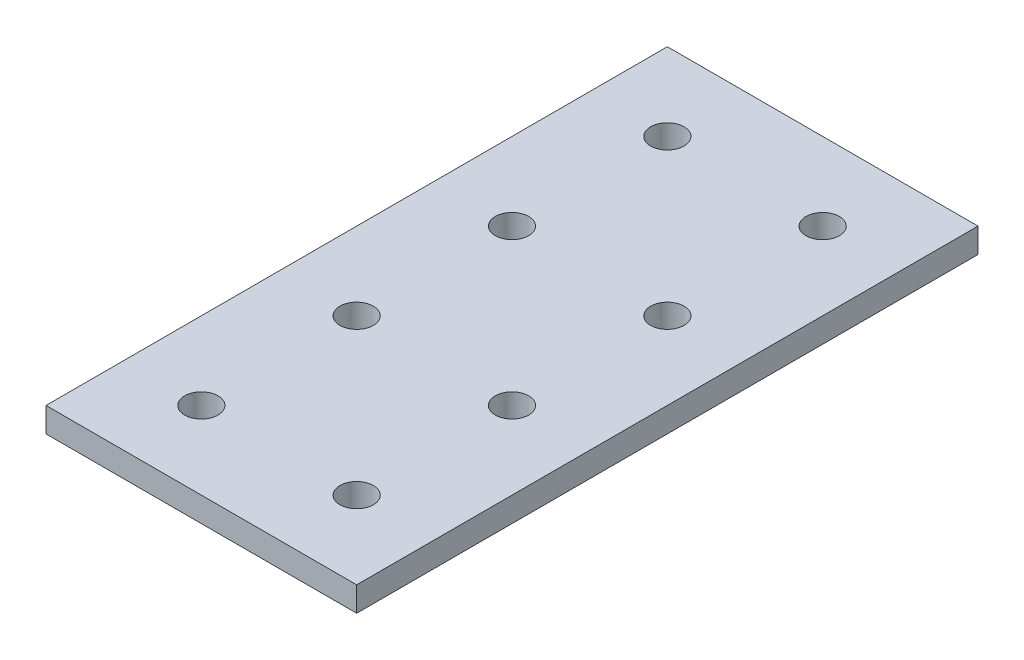
ISO-10303-21;
HEADER;
FILE_DESCRIPTION(('STEP AP214'),'2;1');
FILE_NAME('part.step','',(''),(''),'','','');
FILE_SCHEMA(('AUTOMOTIVE_DESIGN { 1 0 10303 214 1 1 1 1 }'));
ENDSEC;
DATA;
#1=APPLICATION_CONTEXT('core data for automotive mechanical design processes');
#2=APPLICATION_PROTOCOL_DEFINITION('international standard','automotive_design',2000,#1);
#3=PRODUCT_CONTEXT('',#1,'mechanical');
#4=PRODUCT('Part','Part','',(#3));
#5=PRODUCT_RELATED_PRODUCT_CATEGORY('part','',(#4));
#6=PRODUCT_DEFINITION_FORMATION('','',#4);
#7=PRODUCT_DEFINITION_CONTEXT('part definition',#1,'design');
#8=PRODUCT_DEFINITION('design','',#6,#7);
#9=PRODUCT_DEFINITION_SHAPE('','',#8);
#10=(LENGTH_UNIT() NAMED_UNIT(*) SI_UNIT(.MILLI.,.METRE.));
#11=(NAMED_UNIT(*) PLANE_ANGLE_UNIT() SI_UNIT($,.RADIAN.));
#12=(NAMED_UNIT(*) SI_UNIT($,.STERADIAN.) SOLID_ANGLE_UNIT());
#13=UNCERTAINTY_MEASURE_WITH_UNIT(LENGTH_MEASURE(1.E-05),#10,'distance_accuracy_value','');
#14=(GEOMETRIC_REPRESENTATION_CONTEXT(3) GLOBAL_UNCERTAINTY_ASSIGNED_CONTEXT((#13)) GLOBAL_UNIT_ASSIGNED_CONTEXT((#10,
#11,#12)) REPRESENTATION_CONTEXT('',''));
#15=CARTESIAN_POINT('',(0.,0.,0.));
#16=DIRECTION('',(0.,0.,1.));
#17=DIRECTION('',(1.,0.,0.));
#18=AXIS2_PLACEMENT_3D('',#15,#16,#17);
#19=CARTESIAN_POINT('',(0.,3.175,0.));
#20=DIRECTION('',(1.,0.,0.));
#21=DIRECTION('',(0.,0.,-1.));
#22=AXIS2_PLACEMENT_3D('',#19,#20,#21);
#23=PLANE('',#22);
#24=DIRECTION('',(0.,0.,1.));
#25=VECTOR('',#24,1.);
#26=CARTESIAN_POINT('',(0.,0.,0.));
#27=LINE('',#26,#25);
#28=CARTESIAN_POINT('',(0.,0.,-80.));
#29=VERTEX_POINT('',#28);
#30=CARTESIAN_POINT('',(0.,0.,0.));
#31=VERTEX_POINT('',#30);
#32=EDGE_CURVE('E102',#29,#31,#27,.T.);
#33=ORIENTED_EDGE('',*,*,#32,.T.);
#34=DIRECTION('',(0.,-1.,0.));
#35=VECTOR('',#34,1.);
#36=CARTESIAN_POINT('',(0.,3.175,0.));
#37=LINE('',#36,#35);
#38=CARTESIAN_POINT('',(0.,3.175,0.));
#39=VERTEX_POINT('',#38);
#40=EDGE_CURVE('E11',#39,#31,#37,.T.);
#41=ORIENTED_EDGE('',*,*,#40,.F.);
#42=DIRECTION('',(0.,0.,1.));
#43=VECTOR('',#42,1.);
#44=CARTESIAN_POINT('',(0.,3.175,0.));
#45=LINE('',#44,#43);
#46=CARTESIAN_POINT('',(0.,3.175,-80.));
#47=VERTEX_POINT('',#46);
#48=EDGE_CURVE('E90',#47,#39,#45,.T.);
#49=ORIENTED_EDGE('',*,*,#48,.F.);
#50=DIRECTION('',(0.,-1.,0.));
#51=VECTOR('',#50,1.);
#52=CARTESIAN_POINT('',(0.,3.175,-80.));
#53=LINE('',#52,#51);
#54=EDGE_CURVE('E98',#47,#29,#53,.T.);
#55=ORIENTED_EDGE('',*,*,#54,.T.);
#56=EDGE_LOOP('',(#33,#41,#49,#55));
#57=FACE_BOUND('',#56,.T.);
#58=ADVANCED_FACE('F39',(#57),#23,.F.);
#59=CARTESIAN_POINT('',(0.,3.175,0.));
#60=DIRECTION('',(0.,0.,-1.));
#61=DIRECTION('',(-1.,0.,0.));
#62=AXIS2_PLACEMENT_3D('',#59,#60,#61);
#63=PLANE('',#62);
#64=DIRECTION('',(1.,0.,0.));
#65=VECTOR('',#64,1.);
#66=CARTESIAN_POINT('',(0.,0.,0.));
#67=LINE('',#66,#65);
#68=CARTESIAN_POINT('',(40.,0.,0.));
#69=VERTEX_POINT('',#68);
#70=EDGE_CURVE('E94',#31,#69,#67,.T.);
#71=ORIENTED_EDGE('',*,*,#70,.T.);
#72=DIRECTION('',(0.,-1.,0.));
#73=VECTOR('',#72,1.);
#74=CARTESIAN_POINT('',(40.,3.175,0.));
#75=LINE('',#74,#73);
#76=CARTESIAN_POINT('',(40.,3.175,0.));
#77=VERTEX_POINT('',#76);
#78=EDGE_CURVE('E47',#77,#69,#75,.T.);
#79=ORIENTED_EDGE('',*,*,#78,.F.);
#80=DIRECTION('',(1.,0.,0.));
#81=VECTOR('',#80,1.);
#82=CARTESIAN_POINT('',(0.,3.175,0.));
#83=LINE('',#82,#81);
#84=EDGE_CURVE('E85',#39,#77,#83,.T.);
#85=ORIENTED_EDGE('',*,*,#84,.F.);
#86=ORIENTED_EDGE('',*,*,#40,.T.);
#87=EDGE_LOOP('',(#71,#79,#85,#86));
#88=FACE_BOUND('',#87,.T.);
#89=ADVANCED_FACE('F93',(#88),#63,.F.);
#90=CARTESIAN_POINT('',(40.,3.175,0.));
#91=DIRECTION('',(-1.,0.,0.));
#92=DIRECTION('',(0.,0.,1.));
#93=AXIS2_PLACEMENT_3D('',#90,#91,#92);
#94=PLANE('',#93);
#95=DIRECTION('',(0.,0.,-1.));
#96=VECTOR('',#95,1.);
#97=CARTESIAN_POINT('',(40.,0.,0.));
#98=LINE('',#97,#96);
#99=CARTESIAN_POINT('',(40.,0.,-80.));
#100=VERTEX_POINT('',#99);
#101=EDGE_CURVE('E72',#69,#100,#98,.T.);
#102=ORIENTED_EDGE('',*,*,#101,.T.);
#103=DIRECTION('',(0.,-1.,0.));
#104=VECTOR('',#103,1.);
#105=CARTESIAN_POINT('',(40.,3.175,-80.));
#106=LINE('',#105,#104);
#107=CARTESIAN_POINT('',(40.,3.175,-80.));
#108=VERTEX_POINT('',#107);
#109=EDGE_CURVE('E95',#108,#100,#106,.T.);
#110=ORIENTED_EDGE('',*,*,#109,.F.);
#111=DIRECTION('',(0.,0.,-1.));
#112=VECTOR('',#111,1.);
#113=CARTESIAN_POINT('',(40.,3.175,0.));
#114=LINE('',#113,#112);
#115=EDGE_CURVE('E88',#77,#108,#114,.T.);
#116=ORIENTED_EDGE('',*,*,#115,.F.);
#117=ORIENTED_EDGE('',*,*,#78,.T.);
#118=EDGE_LOOP('',(#102,#110,#116,#117));
#119=FACE_BOUND('',#118,.T.);
#120=ADVANCED_FACE('F96',(#119),#94,.F.);
#121=CARTESIAN_POINT('',(0.,3.175,-80.));
#122=DIRECTION('',(0.,0.,1.));
#123=DIRECTION('',(1.,0.,0.));
#124=AXIS2_PLACEMENT_3D('',#121,#122,#123);
#125=PLANE('',#124);
#126=DIRECTION('',(-1.,0.,0.));
#127=VECTOR('',#126,1.);
#128=CARTESIAN_POINT('',(0.,0.,-80.));
#129=LINE('',#128,#127);
#130=EDGE_CURVE('E78',#100,#29,#129,.T.);
#131=ORIENTED_EDGE('',*,*,#130,.T.);
#132=ORIENTED_EDGE('',*,*,#54,.F.);
#133=DIRECTION('',(-1.,0.,0.));
#134=VECTOR('',#133,1.);
#135=CARTESIAN_POINT('',(0.,3.175,-80.));
#136=LINE('',#135,#134);
#137=EDGE_CURVE('E55',#108,#47,#136,.T.);
#138=ORIENTED_EDGE('',*,*,#137,.F.);
#139=ORIENTED_EDGE('',*,*,#109,.T.);
#140=EDGE_LOOP('',(#131,#132,#138,#139));
#141=FACE_BOUND('',#140,.T.);
#142=ADVANCED_FACE('F110',(#141),#125,.F.);
#143=CARTESIAN_POINT('',(0.,3.175,0.));
#144=DIRECTION('',(0.,-1.,0.));
#145=DIRECTION('',(0.,0.,-1.));
#146=AXIS2_PLACEMENT_3D('',#143,#144,#145);
#147=PLANE('',#146);
#148=CARTESIAN_POINT('',(10.,3.175,-70.));
#149=DIRECTION('',(0.,1.,0.));
#150=DIRECTION('',(0.,0.,1.));
#151=AXIS2_PLACEMENT_3D('',#148,#149,#150);
#152=CIRCLE('',#151,2.14999999999999);
#153=CARTESIAN_POINT('',(10.,3.175,-67.85));
#154=VERTEX_POINT('',#153);
#155=EDGE_CURVE('E160',#154,#154,#152,.T.);
#156=ORIENTED_EDGE('',*,*,#155,.F.);
#157=EDGE_LOOP('',(#156));
#158=FACE_BOUND('',#157,.T.);
#159=CARTESIAN_POINT('',(30.,3.175,-70.));
#160=DIRECTION('',(0.,1.,0.));
#161=DIRECTION('',(0.,0.,1.));
#162=AXIS2_PLACEMENT_3D('',#159,#160,#161);
#163=CIRCLE('',#162,2.14999999999999);
#164=CARTESIAN_POINT('',(30.,3.175,-67.85));
#165=VERTEX_POINT('',#164);
#166=EDGE_CURVE('E154',#165,#165,#163,.T.);
#167=ORIENTED_EDGE('',*,*,#166,.F.);
#168=EDGE_LOOP('',(#167));
#169=FACE_BOUND('',#168,.T.);
#170=CARTESIAN_POINT('',(30.,3.175,-50.));
#171=DIRECTION('',(0.,1.,0.));
#172=DIRECTION('',(0.,0.,1.));
#173=AXIS2_PLACEMENT_3D('',#170,#171,#172);
#174=CIRCLE('',#173,2.14999999999999);
#175=CARTESIAN_POINT('',(30.,3.175,-47.85));
#176=VERTEX_POINT('',#175);
#177=EDGE_CURVE('E148',#176,#176,#174,.T.);
#178=ORIENTED_EDGE('',*,*,#177,.F.);
#179=EDGE_LOOP('',(#178));
#180=FACE_BOUND('',#179,.T.);
#181=CARTESIAN_POINT('',(30.,3.175,-30.));
#182=DIRECTION('',(0.,1.,0.));
#183=DIRECTION('',(0.,0.,1.));
#184=AXIS2_PLACEMENT_3D('',#181,#182,#183);
#185=CIRCLE('',#184,2.14999999999999);
#186=CARTESIAN_POINT('',(30.,3.175,-27.85));
#187=VERTEX_POINT('',#186);
#188=EDGE_CURVE('E142',#187,#187,#185,.T.);
#189=ORIENTED_EDGE('',*,*,#188,.F.);
#190=EDGE_LOOP('',(#189));
#191=FACE_BOUND('',#190,.T.);
#192=CARTESIAN_POINT('',(30.,3.175,-10.));
#193=DIRECTION('',(0.,1.,0.));
#194=DIRECTION('',(0.,0.,1.));
#195=AXIS2_PLACEMENT_3D('',#192,#193,#194);
#196=CIRCLE('',#195,2.14999999999999);
#197=CARTESIAN_POINT('',(30.,3.175,-7.85000000000002));
#198=VERTEX_POINT('',#197);
#199=EDGE_CURVE('E136',#198,#198,#196,.T.);
#200=ORIENTED_EDGE('',*,*,#199,.F.);
#201=EDGE_LOOP('',(#200));
#202=FACE_BOUND('',#201,.T.);
#203=CARTESIAN_POINT('',(10.,3.175,-50.));
#204=DIRECTION('',(0.,1.,0.));
#205=DIRECTION('',(0.,0.,1.));
#206=AXIS2_PLACEMENT_3D('',#203,#204,#205);
#207=CIRCLE('',#206,2.14999999999999);
#208=CARTESIAN_POINT('',(10.,3.175,-47.85));
#209=VERTEX_POINT('',#208);
#210=EDGE_CURVE('E130',#209,#209,#207,.T.);
#211=ORIENTED_EDGE('',*,*,#210,.F.);
#212=EDGE_LOOP('',(#211));
#213=FACE_BOUND('',#212,.T.);
#214=CARTESIAN_POINT('',(10.,3.175,-30.));
#215=DIRECTION('',(0.,1.,0.));
#216=DIRECTION('',(0.,0.,1.));
#217=AXIS2_PLACEMENT_3D('',#214,#215,#216);
#218=CIRCLE('',#217,2.14999999999999);
#219=CARTESIAN_POINT('',(10.,3.175,-27.85));
#220=VERTEX_POINT('',#219);
#221=EDGE_CURVE('E124',#220,#220,#218,.T.);
#222=ORIENTED_EDGE('',*,*,#221,.F.);
#223=EDGE_LOOP('',(#222));
#224=FACE_BOUND('',#223,.T.);
#225=CARTESIAN_POINT('',(10.,3.175,-10.));
#226=DIRECTION('',(0.,1.,0.));
#227=DIRECTION('',(0.,0.,1.));
#228=AXIS2_PLACEMENT_3D('',#225,#226,#227);
#229=CIRCLE('',#228,2.14999999999999);
#230=CARTESIAN_POINT('',(10.,3.175,-7.85000000000002));
#231=VERTEX_POINT('',#230);
#232=EDGE_CURVE('E118',#231,#231,#229,.T.);
#233=ORIENTED_EDGE('',*,*,#232,.F.);
#234=EDGE_LOOP('',(#233));
#235=FACE_BOUND('',#234,.T.);
#236=ORIENTED_EDGE('',*,*,#48,.T.);
#237=ORIENTED_EDGE('',*,*,#84,.T.);
#238=ORIENTED_EDGE('',*,*,#115,.T.);
#239=ORIENTED_EDGE('',*,*,#137,.T.);
#240=EDGE_LOOP('',(#236,#237,#238,#239));
#241=FACE_BOUND('',#240,.T.);
#242=ADVANCED_FACE('F86',(#158,#169,#180,#191,#202,#213,#224,#235,#241),#147,.F.);
#243=CARTESIAN_POINT('',(0.,0.,0.));
#244=DIRECTION('',(0.,-1.,0.));
#245=DIRECTION('',(0.,0.,-1.));
#246=AXIS2_PLACEMENT_3D('',#243,#244,#245);
#247=PLANE('',#246);
#248=CARTESIAN_POINT('',(10.,0.,-70.));
#249=DIRECTION('',(0.,1.,0.));
#250=DIRECTION('',(0.,0.,1.));
#251=AXIS2_PLACEMENT_3D('',#248,#249,#250);
#252=CIRCLE('',#251,2.15);
#253=CARTESIAN_POINT('',(10.,0.,-67.85));
#254=VERTEX_POINT('',#253);
#255=EDGE_CURVE('E157',#254,#254,#252,.T.);
#256=ORIENTED_EDGE('',*,*,#255,.T.);
#257=EDGE_LOOP('',(#256));
#258=FACE_BOUND('',#257,.T.);
#259=CARTESIAN_POINT('',(30.,0.,-70.));
#260=DIRECTION('',(0.,1.,0.));
#261=DIRECTION('',(0.,0.,1.));
#262=AXIS2_PLACEMENT_3D('',#259,#260,#261);
#263=CIRCLE('',#262,2.15);
#264=CARTESIAN_POINT('',(30.,0.,-67.85));
#265=VERTEX_POINT('',#264);
#266=EDGE_CURVE('E151',#265,#265,#263,.T.);
#267=ORIENTED_EDGE('',*,*,#266,.T.);
#268=EDGE_LOOP('',(#267));
#269=FACE_BOUND('',#268,.T.);
#270=CARTESIAN_POINT('',(30.,0.,-50.));
#271=DIRECTION('',(0.,1.,0.));
#272=DIRECTION('',(0.,0.,1.));
#273=AXIS2_PLACEMENT_3D('',#270,#271,#272);
#274=CIRCLE('',#273,2.15);
#275=CARTESIAN_POINT('',(30.,0.,-47.85));
#276=VERTEX_POINT('',#275);
#277=EDGE_CURVE('E145',#276,#276,#274,.T.);
#278=ORIENTED_EDGE('',*,*,#277,.T.);
#279=EDGE_LOOP('',(#278));
#280=FACE_BOUND('',#279,.T.);
#281=CARTESIAN_POINT('',(30.,0.,-30.));
#282=DIRECTION('',(0.,1.,0.));
#283=DIRECTION('',(0.,0.,1.));
#284=AXIS2_PLACEMENT_3D('',#281,#282,#283);
#285=CIRCLE('',#284,2.15);
#286=CARTESIAN_POINT('',(30.,0.,-27.85));
#287=VERTEX_POINT('',#286);
#288=EDGE_CURVE('E139',#287,#287,#285,.T.);
#289=ORIENTED_EDGE('',*,*,#288,.T.);
#290=EDGE_LOOP('',(#289));
#291=FACE_BOUND('',#290,.T.);
#292=CARTESIAN_POINT('',(30.,0.,-10.));
#293=DIRECTION('',(0.,1.,0.));
#294=DIRECTION('',(0.,0.,1.));
#295=AXIS2_PLACEMENT_3D('',#292,#293,#294);
#296=CIRCLE('',#295,2.15);
#297=CARTESIAN_POINT('',(30.,0.,-7.85000000000001));
#298=VERTEX_POINT('',#297);
#299=EDGE_CURVE('E133',#298,#298,#296,.T.);
#300=ORIENTED_EDGE('',*,*,#299,.T.);
#301=EDGE_LOOP('',(#300));
#302=FACE_BOUND('',#301,.T.);
#303=CARTESIAN_POINT('',(10.,0.,-50.));
#304=DIRECTION('',(0.,1.,0.));
#305=DIRECTION('',(0.,0.,1.));
#306=AXIS2_PLACEMENT_3D('',#303,#304,#305);
#307=CIRCLE('',#306,2.15);
#308=CARTESIAN_POINT('',(10.,0.,-47.85));
#309=VERTEX_POINT('',#308);
#310=EDGE_CURVE('E127',#309,#309,#307,.T.);
#311=ORIENTED_EDGE('',*,*,#310,.T.);
#312=EDGE_LOOP('',(#311));
#313=FACE_BOUND('',#312,.T.);
#314=CARTESIAN_POINT('',(10.,0.,-30.));
#315=DIRECTION('',(0.,1.,0.));
#316=DIRECTION('',(0.,0.,1.));
#317=AXIS2_PLACEMENT_3D('',#314,#315,#316);
#318=CIRCLE('',#317,2.15);
#319=CARTESIAN_POINT('',(10.,0.,-27.85));
#320=VERTEX_POINT('',#319);
#321=EDGE_CURVE('E121',#320,#320,#318,.T.);
#322=ORIENTED_EDGE('',*,*,#321,.T.);
#323=EDGE_LOOP('',(#322));
#324=FACE_BOUND('',#323,.T.);
#325=CARTESIAN_POINT('',(10.,0.,-10.));
#326=DIRECTION('',(0.,1.,0.));
#327=DIRECTION('',(0.,0.,1.));
#328=AXIS2_PLACEMENT_3D('',#325,#326,#327);
#329=CIRCLE('',#328,2.15);
#330=CARTESIAN_POINT('',(10.,0.,-7.85000000000001));
#331=VERTEX_POINT('',#330);
#332=EDGE_CURVE('E105',#331,#331,#329,.T.);
#333=ORIENTED_EDGE('',*,*,#332,.T.);
#334=EDGE_LOOP('',(#333));
#335=FACE_BOUND('',#334,.T.);
#336=ORIENTED_EDGE('',*,*,#32,.F.);
#337=ORIENTED_EDGE('',*,*,#130,.F.);
#338=ORIENTED_EDGE('',*,*,#101,.F.);
#339=ORIENTED_EDGE('',*,*,#70,.F.);
#340=EDGE_LOOP('',(#336,#337,#338,#339));
#341=FACE_BOUND('',#340,.T.);
#342=ADVANCED_FACE('F113',(#258,#269,#280,#291,#302,#313,#324,#335,#341),#247,.T.);
#343=CARTESIAN_POINT('',(10.,3.175,-10.));
#344=DIRECTION('',(0.,1.,0.));
#345=DIRECTION('',(0.,0.,1.));
#346=AXIS2_PLACEMENT_3D('',#343,#344,#345);
#347=CYLINDRICAL_SURFACE('',#346,2.14999999999999);
#348=ORIENTED_EDGE('',*,*,#332,.F.);
#349=EDGE_LOOP('',(#348));
#350=FACE_BOUND('',#349,.T.);
#351=ORIENTED_EDGE('',*,*,#232,.T.);
#352=EDGE_LOOP('',(#351));
#353=FACE_BOUND('',#352,.T.);
#354=ADVANCED_FACE('F183',(#350,#353),#347,.F.);
#355=CARTESIAN_POINT('',(10.,3.175,-30.));
#356=DIRECTION('',(0.,1.,0.));
#357=DIRECTION('',(0.,0.,1.));
#358=AXIS2_PLACEMENT_3D('',#355,#356,#357);
#359=CYLINDRICAL_SURFACE('',#358,2.14999999999999);
#360=ORIENTED_EDGE('',*,*,#321,.F.);
#361=EDGE_LOOP('',(#360));
#362=FACE_BOUND('',#361,.T.);
#363=ORIENTED_EDGE('',*,*,#221,.T.);
#364=EDGE_LOOP('',(#363));
#365=FACE_BOUND('',#364,.T.);
#366=ADVANCED_FACE('F185',(#362,#365),#359,.F.);
#367=CARTESIAN_POINT('',(10.,3.175,-50.));
#368=DIRECTION('',(0.,1.,0.));
#369=DIRECTION('',(0.,0.,1.));
#370=AXIS2_PLACEMENT_3D('',#367,#368,#369);
#371=CYLINDRICAL_SURFACE('',#370,2.14999999999999);
#372=ORIENTED_EDGE('',*,*,#310,.F.);
#373=EDGE_LOOP('',(#372));
#374=FACE_BOUND('',#373,.T.);
#375=ORIENTED_EDGE('',*,*,#210,.T.);
#376=EDGE_LOOP('',(#375));
#377=FACE_BOUND('',#376,.T.);
#378=ADVANCED_FACE('F192',(#374,#377),#371,.F.);
#379=CARTESIAN_POINT('',(30.,3.175,-10.));
#380=DIRECTION('',(0.,1.,0.));
#381=DIRECTION('',(0.,0.,1.));
#382=AXIS2_PLACEMENT_3D('',#379,#380,#381);
#383=CYLINDRICAL_SURFACE('',#382,2.15);
#384=ORIENTED_EDGE('',*,*,#299,.F.);
#385=EDGE_LOOP('',(#384));
#386=FACE_BOUND('',#385,.T.);
#387=ORIENTED_EDGE('',*,*,#199,.T.);
#388=EDGE_LOOP('',(#387));
#389=FACE_BOUND('',#388,.T.);
#390=ADVANCED_FACE('F242',(#386,#389),#383,.F.);
#391=CARTESIAN_POINT('',(30.,3.175,-30.));
#392=DIRECTION('',(0.,1.,0.));
#393=DIRECTION('',(0.,0.,1.));
#394=AXIS2_PLACEMENT_3D('',#391,#392,#393);
#395=CYLINDRICAL_SURFACE('',#394,2.15);
#396=ORIENTED_EDGE('',*,*,#288,.F.);
#397=EDGE_LOOP('',(#396));
#398=FACE_BOUND('',#397,.T.);
#399=ORIENTED_EDGE('',*,*,#188,.T.);
#400=EDGE_LOOP('',(#399));
#401=FACE_BOUND('',#400,.T.);
#402=ADVANCED_FACE('F252',(#398,#401),#395,.F.);
#403=CARTESIAN_POINT('',(30.,3.175,-50.));
#404=DIRECTION('',(0.,1.,0.));
#405=DIRECTION('',(0.,0.,1.));
#406=AXIS2_PLACEMENT_3D('',#403,#404,#405);
#407=CYLINDRICAL_SURFACE('',#406,2.15);
#408=ORIENTED_EDGE('',*,*,#277,.F.);
#409=EDGE_LOOP('',(#408));
#410=FACE_BOUND('',#409,.T.);
#411=ORIENTED_EDGE('',*,*,#177,.T.);
#412=EDGE_LOOP('',(#411));
#413=FACE_BOUND('',#412,.T.);
#414=ADVANCED_FACE('F262',(#410,#413),#407,.F.);
#415=CARTESIAN_POINT('',(30.,3.175,-70.));
#416=DIRECTION('',(0.,1.,0.));
#417=DIRECTION('',(0.,0.,1.));
#418=AXIS2_PLACEMENT_3D('',#415,#416,#417);
#419=CYLINDRICAL_SURFACE('',#418,2.15);
#420=ORIENTED_EDGE('',*,*,#266,.F.);
#421=EDGE_LOOP('',(#420));
#422=FACE_BOUND('',#421,.T.);
#423=ORIENTED_EDGE('',*,*,#166,.T.);
#424=EDGE_LOOP('',(#423));
#425=FACE_BOUND('',#424,.T.);
#426=ADVANCED_FACE('F272',(#422,#425),#419,.F.);
#427=CARTESIAN_POINT('',(10.,3.175,-70.));
#428=DIRECTION('',(0.,1.,0.));
#429=DIRECTION('',(0.,0.,1.));
#430=AXIS2_PLACEMENT_3D('',#427,#428,#429);
#431=CYLINDRICAL_SURFACE('',#430,2.14999999999999);
#432=ORIENTED_EDGE('',*,*,#255,.F.);
#433=EDGE_LOOP('',(#432));
#434=FACE_BOUND('',#433,.T.);
#435=ORIENTED_EDGE('',*,*,#155,.T.);
#436=EDGE_LOOP('',(#435));
#437=FACE_BOUND('',#436,.T.);
#438=ADVANCED_FACE('F164',(#434,#437),#431,.F.);
#439=CLOSED_SHELL('',(#58,#89,#120,#142,#242,#342,#354,#366,#378,#390,#402,#414,#426,#438));
#440=MANIFOLD_SOLID_BREP('B2',#439);
#441=ADVANCED_BREP_SHAPE_REPRESENTATION('',(#18,#440),#14);
#442=SHAPE_DEFINITION_REPRESENTATION(#9,#441);
ENDSEC;
END-ISO-10303-21;
